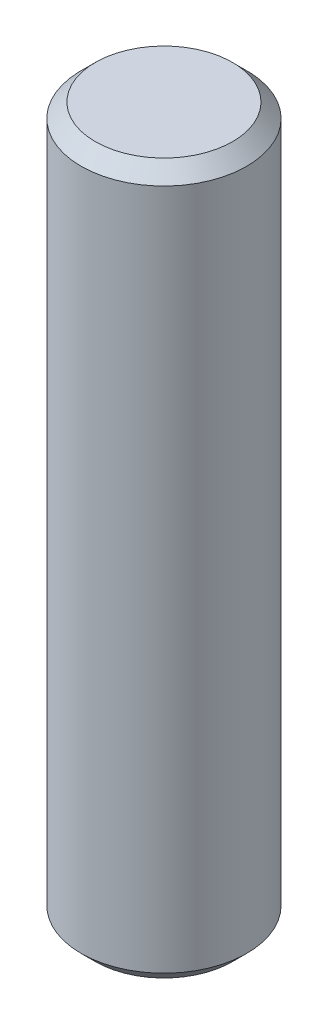
ISO-10303-21;
HEADER;
FILE_DESCRIPTION(('STEP AP214'),'2;1');
FILE_NAME('part.step','',(''),(''),'','','');
FILE_SCHEMA(('AUTOMOTIVE_DESIGN { 1 0 10303 214 1 1 1 1 }'));
ENDSEC;
DATA;
#1=APPLICATION_CONTEXT('core data for automotive mechanical design processes');
#2=APPLICATION_PROTOCOL_DEFINITION('international standard','automotive_design',2000,#1);
#3=PRODUCT_CONTEXT('',#1,'mechanical');
#4=PRODUCT('Part','Part','',(#3));
#5=PRODUCT_RELATED_PRODUCT_CATEGORY('part','',(#4));
#6=PRODUCT_DEFINITION_FORMATION('','',#4);
#7=PRODUCT_DEFINITION_CONTEXT('part definition',#1,'design');
#8=PRODUCT_DEFINITION('design','',#6,#7);
#9=PRODUCT_DEFINITION_SHAPE('','',#8);
#10=(LENGTH_UNIT() NAMED_UNIT(*) SI_UNIT(.MILLI.,.METRE.));
#11=(NAMED_UNIT(*) PLANE_ANGLE_UNIT() SI_UNIT($,.RADIAN.));
#12=(NAMED_UNIT(*) SI_UNIT($,.STERADIAN.) SOLID_ANGLE_UNIT());
#13=UNCERTAINTY_MEASURE_WITH_UNIT(LENGTH_MEASURE(1.E-05),#10,'distance_accuracy_value','');
#14=(GEOMETRIC_REPRESENTATION_CONTEXT(3) GLOBAL_UNCERTAINTY_ASSIGNED_CONTEXT((#13)) GLOBAL_UNIT_ASSIGNED_CONTEXT((#10,
#11,#12)) REPRESENTATION_CONTEXT('',''));
#15=CARTESIAN_POINT('',(0.,0.,0.));
#16=DIRECTION('',(0.,0.,1.));
#17=DIRECTION('',(1.,0.,0.));
#18=AXIS2_PLACEMENT_3D('',#15,#16,#17);
#19=CARTESIAN_POINT('',(0.,-15.,0.));
#20=DIRECTION('',(0.,1.,0.));
#21=DIRECTION('',(0.,0.,1.));
#22=AXIS2_PLACEMENT_3D('',#19,#20,#21);
#23=CYLINDRICAL_SURFACE('',#22,1.75);
#24=CARTESIAN_POINT('',(0.,-14.7,0.));
#25=DIRECTION('',(0.,1.,0.));
#26=DIRECTION('',(0.,0.,1.));
#27=AXIS2_PLACEMENT_3D('',#24,#25,#26);
#28=CIRCLE('',#27,1.75);
#29=CARTESIAN_POINT('',(0.,-14.7,1.75));
#30=VERTEX_POINT('',#29);
#31=EDGE_CURVE('E42',#30,#30,#28,.T.);
#32=ORIENTED_EDGE('',*,*,#31,.T.);
#33=EDGE_LOOP('',(#32));
#34=FACE_BOUND('',#33,.T.);
#35=CARTESIAN_POINT('',(0.,-0.300000000000002,0.));
#36=DIRECTION('',(0.,1.,0.));
#37=DIRECTION('',(0.,0.,1.));
#38=AXIS2_PLACEMENT_3D('',#35,#36,#37);
#39=CIRCLE('',#38,1.75);
#40=CARTESIAN_POINT('',(0.,-0.300000000000002,1.75));
#41=VERTEX_POINT('',#40);
#42=EDGE_CURVE('E46',#41,#41,#39,.F.);
#43=ORIENTED_EDGE('',*,*,#42,.T.);
#44=EDGE_LOOP('',(#43));
#45=FACE_BOUND('',#44,.T.);
#46=ADVANCED_FACE('F31',(#34,#45),#23,.T.);
#47=CARTESIAN_POINT('',(0.,-15.,0.));
#48=DIRECTION('',(0.,1.,0.));
#49=DIRECTION('',(0.,0.,1.));
#50=AXIS2_PLACEMENT_3D('',#47,#48,#49);
#51=PLANE('',#50);
#52=CARTESIAN_POINT('',(0.,-15.,0.));
#53=DIRECTION('',(0.,1.,0.));
#54=DIRECTION('',(0.,0.,1.));
#55=AXIS2_PLACEMENT_3D('',#52,#53,#54);
#56=CIRCLE('',#55,1.45);
#57=CARTESIAN_POINT('',(0.,-15.,1.45));
#58=VERTEX_POINT('',#57);
#59=EDGE_CURVE('E38',#58,#58,#56,.F.);
#60=ORIENTED_EDGE('',*,*,#59,.T.);
#61=EDGE_LOOP('',(#60));
#62=FACE_BOUND('',#61,.T.);
#63=ADVANCED_FACE('F62',(#62),#51,.F.);
#64=CARTESIAN_POINT('',(0.,0.,0.));
#65=DIRECTION('',(0.,1.,0.));
#66=DIRECTION('',(0.,0.,1.));
#67=AXIS2_PLACEMENT_3D('',#64,#65,#66);
#68=PLANE('',#67);
#69=CARTESIAN_POINT('',(0.,0.,0.));
#70=DIRECTION('',(0.,1.,0.));
#71=DIRECTION('',(0.,0.,1.));
#72=AXIS2_PLACEMENT_3D('',#69,#70,#71);
#73=CIRCLE('',#72,1.45);
#74=CARTESIAN_POINT('',(0.,0.,1.45));
#75=VERTEX_POINT('',#74);
#76=EDGE_CURVE('E10',#75,#75,#73,.T.);
#77=ORIENTED_EDGE('',*,*,#76,.T.);
#78=EDGE_LOOP('',(#77));
#79=FACE_BOUND('',#78,.T.);
#80=ADVANCED_FACE('F59',(#79),#68,.T.);
#81=CARTESIAN_POINT('',(0.,-14.7,0.));
#82=DIRECTION('',(0.,1.,0.));
#83=DIRECTION('',(0.,0.,1.));
#84=AXIS2_PLACEMENT_3D('',#81,#82,#83);
#85=CONICAL_SURFACE('',#84,1.75,0.785398163397454);
#86=ORIENTED_EDGE('',*,*,#59,.F.);
#87=EDGE_LOOP('',(#86));
#88=FACE_BOUND('',#87,.T.);
#89=ORIENTED_EDGE('',*,*,#31,.F.);
#90=EDGE_LOOP('',(#89));
#91=FACE_BOUND('',#90,.T.);
#92=ADVANCED_FACE('F55',(#88,#91),#85,.T.);
#93=CARTESIAN_POINT('',(0.,0.,0.));
#94=DIRECTION('',(0.,-1.,0.));
#95=DIRECTION('',(0.,0.,-1.));
#96=AXIS2_PLACEMENT_3D('',#93,#94,#95);
#97=CONICAL_SURFACE('',#96,1.45,0.785398163397449);
#98=ORIENTED_EDGE('',*,*,#42,.F.);
#99=EDGE_LOOP('',(#98));
#100=FACE_BOUND('',#99,.T.);
#101=ORIENTED_EDGE('',*,*,#76,.F.);
#102=EDGE_LOOP('',(#101));
#103=FACE_BOUND('',#102,.T.);
#104=ADVANCED_FACE('F33',(#100,#103),#97,.T.);
#105=CLOSED_SHELL('',(#46,#63,#80,#92,#104));
#106=MANIFOLD_SOLID_BREP('B2',#105);
#107=ADVANCED_BREP_SHAPE_REPRESENTATION('',(#18,#106),#14);
#108=SHAPE_DEFINITION_REPRESENTATION(#9,#107);
ENDSEC;
END-ISO-10303-21;
